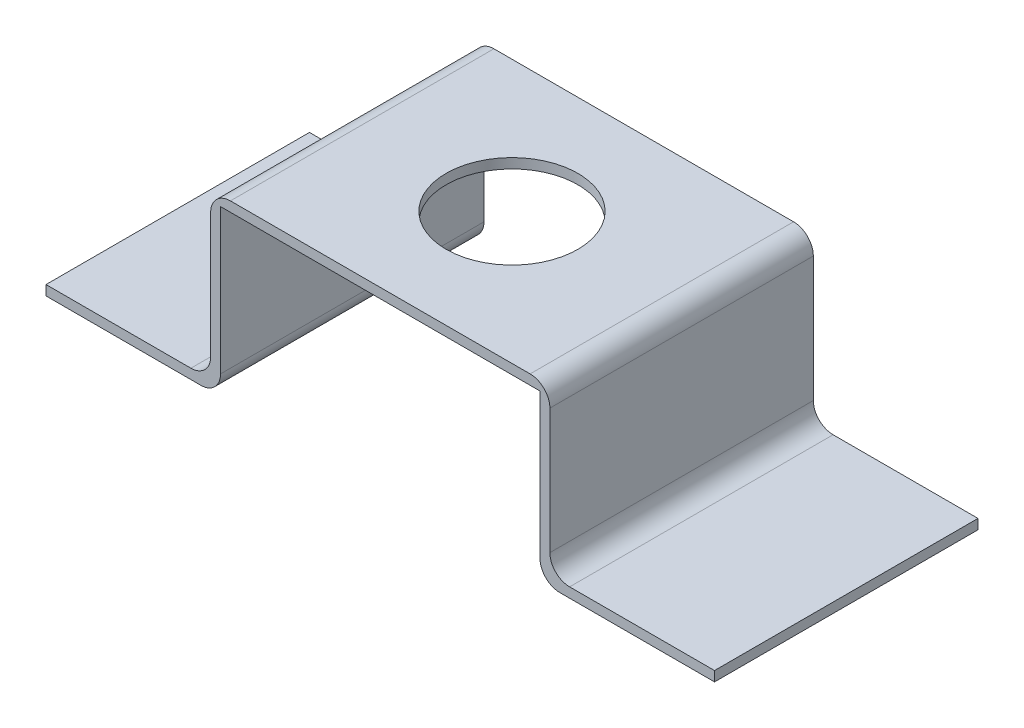
ISO-10303-21;
HEADER;
FILE_DESCRIPTION(('STEP AP214'),'2;1');
FILE_NAME('part.step','',(''),(''),'','','');
FILE_SCHEMA(('AUTOMOTIVE_DESIGN { 1 0 10303 214 1 1 1 1 }'));
ENDSEC;
DATA;
#1=APPLICATION_CONTEXT('core data for automotive mechanical design processes');
#2=APPLICATION_PROTOCOL_DEFINITION('international standard','automotive_design',2000,#1);
#3=PRODUCT_CONTEXT('',#1,'mechanical');
#4=PRODUCT('Part','Part','',(#3));
#5=PRODUCT_RELATED_PRODUCT_CATEGORY('part','',(#4));
#6=PRODUCT_DEFINITION_FORMATION('','',#4);
#7=PRODUCT_DEFINITION_CONTEXT('part definition',#1,'design');
#8=PRODUCT_DEFINITION('design','',#6,#7);
#9=PRODUCT_DEFINITION_SHAPE('','',#8);
#10=(LENGTH_UNIT() NAMED_UNIT(*) SI_UNIT(.MILLI.,.METRE.));
#11=(NAMED_UNIT(*) PLANE_ANGLE_UNIT() SI_UNIT($,.RADIAN.));
#12=(NAMED_UNIT(*) SI_UNIT($,.STERADIAN.) SOLID_ANGLE_UNIT());
#13=UNCERTAINTY_MEASURE_WITH_UNIT(LENGTH_MEASURE(1.E-05),#10,'distance_accuracy_value','');
#14=(GEOMETRIC_REPRESENTATION_CONTEXT(3) GLOBAL_UNCERTAINTY_ASSIGNED_CONTEXT((#13)) GLOBAL_UNIT_ASSIGNED_CONTEXT((#10,
#11,#12)) REPRESENTATION_CONTEXT('',''));
#15=CARTESIAN_POINT('',(0.,0.,0.));
#16=DIRECTION('',(0.,0.,1.));
#17=DIRECTION('',(1.,0.,0.));
#18=AXIS2_PLACEMENT_3D('',#15,#16,#17);
#19=CARTESIAN_POINT('',(-12.5,1.5,-20.));
#20=DIRECTION('',(0.,0.,1.));
#21=DIRECTION('',(1.,0.,0.));
#22=AXIS2_PLACEMENT_3D('',#19,#20,#21);
#23=PLANE('',#22);
#24=DIRECTION('',(-1.,0.,0.));
#25=VECTOR('',#24,1.);
#26=CARTESIAN_POINT('',(12.5,26.5,-20.));
#27=LINE('',#26,#25);
#28=CARTESIAN_POINT('',(61.,26.5,-20.));
#29=VERTEX_POINT('',#28);
#30=CARTESIAN_POINT('',(15.5,26.5,-20.));
#31=VERTEX_POINT('',#30);
#32=EDGE_CURVE('E214',#29,#31,#27,.T.);
#33=ORIENTED_EDGE('',*,*,#32,.F.);
#34=CARTESIAN_POINT('',(61.,23.5,-20.));
#35=DIRECTION('',(0.,0.,1.));
#36=DIRECTION('',(1.,0.,0.));
#37=AXIS2_PLACEMENT_3D('',#34,#35,#36);
#38=CIRCLE('',#37,3.);
#39=CARTESIAN_POINT('',(64.,23.5,-20.));
#40=VERTEX_POINT('',#39);
#41=EDGE_CURVE('E278',#29,#40,#38,.F.);
#42=ORIENTED_EDGE('',*,*,#41,.T.);
#43=DIRECTION('',(0.,1.,0.));
#44=VECTOR('',#43,1.);
#45=CARTESIAN_POINT('',(64.,0.,-20.));
#46=LINE('',#45,#44);
#47=CARTESIAN_POINT('',(64.,4.5,-20.));
#48=VERTEX_POINT('',#47);
#49=EDGE_CURVE('E200',#48,#40,#46,.T.);
#50=ORIENTED_EDGE('',*,*,#49,.F.);
#51=CARTESIAN_POINT('',(67.,4.5,-20.));
#52=DIRECTION('',(0.,0.,1.));
#53=DIRECTION('',(1.,0.,0.));
#54=AXIS2_PLACEMENT_3D('',#51,#52,#53);
#55=CIRCLE('',#54,3.);
#56=CARTESIAN_POINT('',(67.,1.5,-20.));
#57=VERTEX_POINT('',#56);
#58=EDGE_CURVE('E303',#48,#57,#55,.T.);
#59=ORIENTED_EDGE('',*,*,#58,.T.);
#60=DIRECTION('',(-1.,0.,0.));
#61=VECTOR('',#60,1.);
#62=CARTESIAN_POINT('',(64.,1.5,-20.));
#63=LINE('',#62,#61);
#64=CARTESIAN_POINT('',(89.,1.5,-20.));
#65=VERTEX_POINT('',#64);
#66=EDGE_CURVE('E189',#65,#57,#63,.T.);
#67=ORIENTED_EDGE('',*,*,#66,.F.);
#68=DIRECTION('',(0.,-1.,0.));
#69=VECTOR('',#68,1.);
#70=CARTESIAN_POINT('',(89.,1.5,-20.));
#71=LINE('',#70,#69);
#72=CARTESIAN_POINT('',(89.,0.,-20.));
#73=VERTEX_POINT('',#72);
#74=EDGE_CURVE('E184',#65,#73,#71,.T.);
#75=ORIENTED_EDGE('',*,*,#74,.T.);
#76=DIRECTION('',(-1.,0.,0.));
#77=VECTOR('',#76,1.);
#78=CARTESIAN_POINT('',(64.,0.,-20.));
#79=LINE('',#78,#77);
#80=CARTESIAN_POINT('',(65.5,0.,-20.));
#81=VERTEX_POINT('',#80);
#82=EDGE_CURVE('E203',#73,#81,#79,.T.);
#83=ORIENTED_EDGE('',*,*,#82,.T.);
#84=CARTESIAN_POINT('',(65.5,3.,-20.));
#85=DIRECTION('',(0.,0.,1.));
#86=DIRECTION('',(1.,0.,0.));
#87=AXIS2_PLACEMENT_3D('',#84,#85,#86);
#88=CIRCLE('',#87,3.);
#89=CARTESIAN_POINT('',(62.5,3.,-20.));
#90=VERTEX_POINT('',#89);
#91=EDGE_CURVE('E276',#81,#90,#88,.F.);
#92=ORIENTED_EDGE('',*,*,#91,.T.);
#93=DIRECTION('',(0.,1.,0.));
#94=VECTOR('',#93,1.);
#95=CARTESIAN_POINT('',(62.5,0.,-20.));
#96=LINE('',#95,#94);
#97=CARTESIAN_POINT('',(62.5,25.,-20.));
#98=VERTEX_POINT('',#97);
#99=EDGE_CURVE('E201',#90,#98,#96,.T.);
#100=ORIENTED_EDGE('',*,*,#99,.T.);
#101=DIRECTION('',(-1.,0.,0.));
#102=VECTOR('',#101,1.);
#103=CARTESIAN_POINT('',(12.5,25.,-20.));
#104=LINE('',#103,#102);
#105=CARTESIAN_POINT('',(14.,25.,-20.));
#106=VERTEX_POINT('',#105);
#107=EDGE_CURVE('E215',#98,#106,#104,.T.);
#108=ORIENTED_EDGE('',*,*,#107,.T.);
#109=DIRECTION('',(0.,1.,0.));
#110=VECTOR('',#109,1.);
#111=CARTESIAN_POINT('',(14.,25.,-20.));
#112=LINE('',#111,#110);
#113=CARTESIAN_POINT('',(14.,3.,-20.));
#114=VERTEX_POINT('',#113);
#115=EDGE_CURVE('E225',#114,#106,#112,.T.);
#116=ORIENTED_EDGE('',*,*,#115,.F.);
#117=CARTESIAN_POINT('',(11.,3.,-20.));
#118=DIRECTION('',(0.,0.,1.));
#119=DIRECTION('',(1.,0.,0.));
#120=AXIS2_PLACEMENT_3D('',#117,#118,#119);
#121=CIRCLE('',#120,3.);
#122=CARTESIAN_POINT('',(11.,0.,-20.));
#123=VERTEX_POINT('',#122);
#124=EDGE_CURVE('E274',#114,#123,#121,.F.);
#125=ORIENTED_EDGE('',*,*,#124,.T.);
#126=DIRECTION('',(-1.,0.,0.));
#127=VECTOR('',#126,1.);
#128=CARTESIAN_POINT('',(-12.5,0.,-20.));
#129=LINE('',#128,#127);
#130=CARTESIAN_POINT('',(-12.5,0.,-20.));
#131=VERTEX_POINT('',#130);
#132=EDGE_CURVE('E234',#123,#131,#129,.T.);
#133=ORIENTED_EDGE('',*,*,#132,.T.);
#134=DIRECTION('',(0.,-1.,0.));
#135=VECTOR('',#134,1.);
#136=CARTESIAN_POINT('',(-12.5,1.5,-20.));
#137=LINE('',#136,#135);
#138=CARTESIAN_POINT('',(-12.5,1.5,-20.));
#139=VERTEX_POINT('',#138);
#140=EDGE_CURVE('E253',#139,#131,#137,.T.);
#141=ORIENTED_EDGE('',*,*,#140,.F.);
#142=DIRECTION('',(-1.,0.,0.));
#143=VECTOR('',#142,1.);
#144=CARTESIAN_POINT('',(-12.5,1.5,-20.));
#145=LINE('',#144,#143);
#146=CARTESIAN_POINT('',(9.5,1.5,-20.));
#147=VERTEX_POINT('',#146);
#148=EDGE_CURVE('E237',#147,#139,#145,.T.);
#149=ORIENTED_EDGE('',*,*,#148,.F.);
#150=CARTESIAN_POINT('',(9.5,4.5,-20.));
#151=DIRECTION('',(0.,0.,1.));
#152=DIRECTION('',(1.,0.,0.));
#153=AXIS2_PLACEMENT_3D('',#150,#151,#152);
#154=CIRCLE('',#153,3.);
#155=CARTESIAN_POINT('',(12.5,4.5,-20.));
#156=VERTEX_POINT('',#155);
#157=EDGE_CURVE('E46',#147,#156,#154,.T.);
#158=ORIENTED_EDGE('',*,*,#157,.T.);
#159=DIRECTION('',(0.,1.,0.));
#160=VECTOR('',#159,1.);
#161=CARTESIAN_POINT('',(12.5,25.,-20.));
#162=LINE('',#161,#160);
#163=CARTESIAN_POINT('',(12.5,23.5,-20.));
#164=VERTEX_POINT('',#163);
#165=EDGE_CURVE('E218',#156,#164,#162,.T.);
#166=ORIENTED_EDGE('',*,*,#165,.T.);
#167=CARTESIAN_POINT('',(15.5,23.5,-20.));
#168=DIRECTION('',(0.,0.,1.));
#169=DIRECTION('',(1.,0.,0.));
#170=AXIS2_PLACEMENT_3D('',#167,#168,#169);
#171=CIRCLE('',#170,3.);
#172=EDGE_CURVE('E272',#164,#31,#171,.F.);
#173=ORIENTED_EDGE('',*,*,#172,.T.);
#174=EDGE_LOOP('',(#33,#42,#50,#59,#67,#75,#83,#92,#100,#108,#116,#125,#133,#141,#149,#158,#166,#173));
#175=FACE_BOUND('',#174,.T.);
#176=ADVANCED_FACE('F38',(#175),#23,.F.);
#177=CARTESIAN_POINT('',(-12.5,1.5,20.));
#178=DIRECTION('',(1.,0.,0.));
#179=DIRECTION('',(0.,0.,-1.));
#180=AXIS2_PLACEMENT_3D('',#177,#178,#179);
#181=PLANE('',#180);
#182=DIRECTION('',(0.,0.,1.));
#183=VECTOR('',#182,1.);
#184=CARTESIAN_POINT('',(-12.5,0.,20.));
#185=LINE('',#184,#183);
#186=CARTESIAN_POINT('',(-12.5,0.,20.));
#187=VERTEX_POINT('',#186);
#188=EDGE_CURVE('E247',#131,#187,#185,.T.);
#189=ORIENTED_EDGE('',*,*,#188,.T.);
#190=DIRECTION('',(0.,-1.,0.));
#191=VECTOR('',#190,1.);
#192=CARTESIAN_POINT('',(-12.5,1.5,20.));
#193=LINE('',#192,#191);
#194=CARTESIAN_POINT('',(-12.5,1.5,20.));
#195=VERTEX_POINT('',#194);
#196=EDGE_CURVE('E245',#195,#187,#193,.T.);
#197=ORIENTED_EDGE('',*,*,#196,.F.);
#198=DIRECTION('',(0.,0.,1.));
#199=VECTOR('',#198,1.);
#200=CARTESIAN_POINT('',(-12.5,1.5,20.));
#201=LINE('',#200,#199);
#202=EDGE_CURVE('E239',#139,#195,#201,.T.);
#203=ORIENTED_EDGE('',*,*,#202,.F.);
#204=ORIENTED_EDGE('',*,*,#140,.T.);
#205=EDGE_LOOP('',(#189,#197,#203,#204));
#206=FACE_BOUND('',#205,.T.);
#207=ADVANCED_FACE('F336',(#206),#181,.F.);
#208=CARTESIAN_POINT('',(-12.5,1.5,20.));
#209=DIRECTION('',(0.,0.,-1.));
#210=DIRECTION('',(-1.,0.,0.));
#211=AXIS2_PLACEMENT_3D('',#208,#209,#210);
#212=PLANE('',#211);
#213=DIRECTION('',(0.,-1.,0.));
#214=VECTOR('',#213,1.);
#215=CARTESIAN_POINT('',(64.,26.5,20.));
#216=LINE('',#215,#214);
#217=CARTESIAN_POINT('',(64.,23.5,20.));
#218=VERTEX_POINT('',#217);
#219=CARTESIAN_POINT('',(64.,4.5,20.));
#220=VERTEX_POINT('',#219);
#221=EDGE_CURVE('E197',#218,#220,#216,.T.);
#222=ORIENTED_EDGE('',*,*,#221,.F.);
#223=CARTESIAN_POINT('',(61.,23.5,20.));
#224=DIRECTION('',(0.,0.,-1.));
#225=DIRECTION('',(-1.,0.,0.));
#226=AXIS2_PLACEMENT_3D('',#223,#224,#225);
#227=CIRCLE('',#226,3.);
#228=CARTESIAN_POINT('',(61.,26.5,20.));
#229=VERTEX_POINT('',#228);
#230=EDGE_CURVE('E265',#218,#229,#227,.F.);
#231=ORIENTED_EDGE('',*,*,#230,.T.);
#232=DIRECTION('',(1.,0.,0.));
#233=VECTOR('',#232,1.);
#234=CARTESIAN_POINT('',(62.5,26.5,20.));
#235=LINE('',#234,#233);
#236=CARTESIAN_POINT('',(15.5,26.5,20.));
#237=VERTEX_POINT('',#236);
#238=EDGE_CURVE('E211',#237,#229,#235,.T.);
#239=ORIENTED_EDGE('',*,*,#238,.F.);
#240=CARTESIAN_POINT('',(15.5,23.5,20.));
#241=DIRECTION('',(0.,0.,-1.));
#242=DIRECTION('',(-1.,0.,0.));
#243=AXIS2_PLACEMENT_3D('',#240,#241,#242);
#244=CIRCLE('',#243,3.);
#245=CARTESIAN_POINT('',(12.5,23.5,20.));
#246=VERTEX_POINT('',#245);
#247=EDGE_CURVE('E259',#237,#246,#244,.F.);
#248=ORIENTED_EDGE('',*,*,#247,.T.);
#249=DIRECTION('',(0.,-1.,0.));
#250=VECTOR('',#249,1.);
#251=CARTESIAN_POINT('',(12.5,0.,20.));
#252=LINE('',#251,#250);
#253=CARTESIAN_POINT('',(12.5,4.5,20.));
#254=VERTEX_POINT('',#253);
#255=EDGE_CURVE('E228',#246,#254,#252,.T.);
#256=ORIENTED_EDGE('',*,*,#255,.T.);
#257=CARTESIAN_POINT('',(9.5,4.5,20.));
#258=DIRECTION('',(0.,0.,-1.));
#259=DIRECTION('',(-1.,0.,0.));
#260=AXIS2_PLACEMENT_3D('',#257,#258,#259);
#261=CIRCLE('',#260,3.);
#262=CARTESIAN_POINT('',(9.5,1.5,20.));
#263=VERTEX_POINT('',#262);
#264=EDGE_CURVE('E11',#254,#263,#261,.T.);
#265=ORIENTED_EDGE('',*,*,#264,.T.);
#266=DIRECTION('',(1.,0.,0.));
#267=VECTOR('',#266,1.);
#268=CARTESIAN_POINT('',(-12.5,1.5,20.));
#269=LINE('',#268,#267);
#270=EDGE_CURVE('E242',#195,#263,#269,.T.);
#271=ORIENTED_EDGE('',*,*,#270,.F.);
#272=ORIENTED_EDGE('',*,*,#196,.T.);
#273=DIRECTION('',(1.,0.,0.));
#274=VECTOR('',#273,1.);
#275=CARTESIAN_POINT('',(-12.5,0.,20.));
#276=LINE('',#275,#274);
#277=CARTESIAN_POINT('',(11.,0.,20.));
#278=VERTEX_POINT('',#277);
#279=EDGE_CURVE('E240',#187,#278,#276,.T.);
#280=ORIENTED_EDGE('',*,*,#279,.T.);
#281=CARTESIAN_POINT('',(11.,3.,20.));
#282=DIRECTION('',(0.,0.,-1.));
#283=DIRECTION('',(-1.,0.,0.));
#284=AXIS2_PLACEMENT_3D('',#281,#282,#283);
#285=CIRCLE('',#284,3.);
#286=CARTESIAN_POINT('',(14.,3.,20.));
#287=VERTEX_POINT('',#286);
#288=EDGE_CURVE('E261',#278,#287,#285,.F.);
#289=ORIENTED_EDGE('',*,*,#288,.T.);
#290=DIRECTION('',(0.,-1.,0.));
#291=VECTOR('',#290,1.);
#292=CARTESIAN_POINT('',(14.,0.,20.));
#293=LINE('',#292,#291);
#294=CARTESIAN_POINT('',(14.,25.,20.));
#295=VERTEX_POINT('',#294);
#296=EDGE_CURVE('E231',#295,#287,#293,.T.);
#297=ORIENTED_EDGE('',*,*,#296,.F.);
#298=DIRECTION('',(1.,0.,0.));
#299=VECTOR('',#298,1.);
#300=CARTESIAN_POINT('',(62.5,25.,20.));
#301=LINE('',#300,#299);
#302=CARTESIAN_POINT('',(62.5,25.,20.));
#303=VERTEX_POINT('',#302);
#304=EDGE_CURVE('E210',#295,#303,#301,.T.);
#305=ORIENTED_EDGE('',*,*,#304,.T.);
#306=DIRECTION('',(0.,-1.,0.));
#307=VECTOR('',#306,1.);
#308=CARTESIAN_POINT('',(62.5,26.5,20.));
#309=LINE('',#308,#307);
#310=CARTESIAN_POINT('',(62.5,3.,20.));
#311=VERTEX_POINT('',#310);
#312=EDGE_CURVE('E183',#303,#311,#309,.T.);
#313=ORIENTED_EDGE('',*,*,#312,.T.);
#314=CARTESIAN_POINT('',(65.5,3.,20.));
#315=DIRECTION('',(0.,0.,-1.));
#316=DIRECTION('',(-1.,0.,0.));
#317=AXIS2_PLACEMENT_3D('',#314,#315,#316);
#318=CIRCLE('',#317,3.);
#319=CARTESIAN_POINT('',(65.5,0.,20.));
#320=VERTEX_POINT('',#319);
#321=EDGE_CURVE('E263',#311,#320,#318,.F.);
#322=ORIENTED_EDGE('',*,*,#321,.T.);
#323=DIRECTION('',(-1.,0.,0.));
#324=VECTOR('',#323,1.);
#325=CARTESIAN_POINT('',(64.,0.,20.));
#326=LINE('',#325,#324);
#327=CARTESIAN_POINT('',(89.,0.,20.));
#328=VERTEX_POINT('',#327);
#329=EDGE_CURVE('E179',#328,#320,#326,.T.);
#330=ORIENTED_EDGE('',*,*,#329,.F.);
#331=DIRECTION('',(0.,-1.,0.));
#332=VECTOR('',#331,1.);
#333=CARTESIAN_POINT('',(89.,1.5,20.));
#334=LINE('',#333,#332);
#335=CARTESIAN_POINT('',(89.,1.5,20.));
#336=VERTEX_POINT('',#335);
#337=EDGE_CURVE('E175',#336,#328,#334,.T.);
#338=ORIENTED_EDGE('',*,*,#337,.F.);
#339=DIRECTION('',(1.,0.,0.));
#340=VECTOR('',#339,1.);
#341=CARTESIAN_POINT('',(89.,1.5,20.));
#342=LINE('',#341,#340);
#343=CARTESIAN_POINT('',(67.,1.5,20.));
#344=VERTEX_POINT('',#343);
#345=EDGE_CURVE('E162',#344,#336,#342,.T.);
#346=ORIENTED_EDGE('',*,*,#345,.F.);
#347=CARTESIAN_POINT('',(67.,4.5,20.));
#348=DIRECTION('',(0.,0.,-1.));
#349=DIRECTION('',(-1.,0.,0.));
#350=AXIS2_PLACEMENT_3D('',#347,#348,#349);
#351=CIRCLE('',#350,3.);
#352=EDGE_CURVE('E301',#344,#220,#351,.T.);
#353=ORIENTED_EDGE('',*,*,#352,.T.);
#354=EDGE_LOOP('',(#222,#231,#239,#248,#256,#265,#271,#272,#280,#289,#297,#305,#313,#322,#330,
#338,#346,#353));
#355=FACE_BOUND('',#354,.T.);
#356=ADVANCED_FACE('F177',(#355),#212,.F.);
#357=CARTESIAN_POINT('',(0.,1.5,0.));
#358=DIRECTION('',(0.,1.,0.));
#359=DIRECTION('',(0.,0.,1.));
#360=AXIS2_PLACEMENT_3D('',#357,#358,#359);
#361=PLANE('',#360);
#362=ORIENTED_EDGE('',*,*,#270,.T.);
#363=DIRECTION('',(0.,0.,-1.));
#364=VECTOR('',#363,1.);
#365=CARTESIAN_POINT('',(9.5,1.5,-20.));
#366=LINE('',#365,#364);
#367=EDGE_CURVE('E297',#263,#147,#366,.T.);
#368=ORIENTED_EDGE('',*,*,#367,.T.);
#369=ORIENTED_EDGE('',*,*,#148,.T.);
#370=ORIENTED_EDGE('',*,*,#202,.T.);
#371=EDGE_LOOP('',(#362,#368,#369,#370));
#372=FACE_BOUND('',#371,.T.);
#373=ADVANCED_FACE('F331',(#372),#361,.T.);
#374=CARTESIAN_POINT('',(0.,0.,0.));
#375=DIRECTION('',(0.,1.,0.));
#376=DIRECTION('',(0.,0.,1.));
#377=AXIS2_PLACEMENT_3D('',#374,#375,#376);
#378=PLANE('',#377);
#379=ORIENTED_EDGE('',*,*,#132,.F.);
#380=DIRECTION('',(0.,0.,-1.));
#381=VECTOR('',#380,1.);
#382=CARTESIAN_POINT('',(11.,0.,0.));
#383=LINE('',#382,#381);
#384=EDGE_CURVE('E289',#123,#278,#383,.F.);
#385=ORIENTED_EDGE('',*,*,#384,.T.);
#386=ORIENTED_EDGE('',*,*,#279,.F.);
#387=ORIENTED_EDGE('',*,*,#188,.F.);
#388=EDGE_LOOP('',(#379,#385,#386,#387));
#389=FACE_BOUND('',#388,.T.);
#390=ADVANCED_FACE('F342',(#389),#378,.F.);
#391=CARTESIAN_POINT('',(12.5,0.,0.));
#392=DIRECTION('',(-1.,0.,0.));
#393=DIRECTION('',(0.,0.,1.));
#394=AXIS2_PLACEMENT_3D('',#391,#392,#393);
#395=PLANE('',#394);
#396=ORIENTED_EDGE('',*,*,#165,.F.);
#397=DIRECTION('',(0.,0.,-1.));
#398=VECTOR('',#397,1.);
#399=CARTESIAN_POINT('',(12.5,4.5,20.));
#400=LINE('',#399,#398);
#401=EDGE_CURVE('E59',#156,#254,#400,.F.);
#402=ORIENTED_EDGE('',*,*,#401,.T.);
#403=ORIENTED_EDGE('',*,*,#255,.F.);
#404=DIRECTION('',(0.,0.,1.));
#405=VECTOR('',#404,1.);
#406=CARTESIAN_POINT('',(12.5,23.5,-20.));
#407=LINE('',#406,#405);
#408=EDGE_CURVE('E291',#246,#164,#407,.F.);
#409=ORIENTED_EDGE('',*,*,#408,.T.);
#410=EDGE_LOOP('',(#396,#402,#403,#409));
#411=FACE_BOUND('',#410,.T.);
#412=ADVANCED_FACE('F326',(#411),#395,.T.);
#413=CARTESIAN_POINT('',(14.,0.,0.));
#414=DIRECTION('',(-1.,0.,0.));
#415=DIRECTION('',(0.,0.,1.));
#416=AXIS2_PLACEMENT_3D('',#413,#414,#415);
#417=PLANE('',#416);
#418=ORIENTED_EDGE('',*,*,#296,.T.);
#419=DIRECTION('',(0.,0.,-1.));
#420=VECTOR('',#419,1.);
#421=CARTESIAN_POINT('',(14.,3.,0.));
#422=LINE('',#421,#420);
#423=EDGE_CURVE('E286',#287,#114,#422,.T.);
#424=ORIENTED_EDGE('',*,*,#423,.T.);
#425=ORIENTED_EDGE('',*,*,#115,.T.);
#426=DIRECTION('',(0.,0.,1.));
#427=VECTOR('',#426,1.);
#428=CARTESIAN_POINT('',(14.,25.,20.));
#429=LINE('',#428,#427);
#430=EDGE_CURVE('E227',#106,#295,#429,.T.);
#431=ORIENTED_EDGE('',*,*,#430,.T.);
#432=EDGE_LOOP('',(#418,#424,#425,#431));
#433=FACE_BOUND('',#432,.T.);
#434=ADVANCED_FACE('F349',(#433),#417,.F.);
#435=CARTESIAN_POINT('',(0.,25.,0.));
#436=DIRECTION('',(0.,-1.,0.));
#437=DIRECTION('',(0.,0.,-1.));
#438=AXIS2_PLACEMENT_3D('',#435,#436,#437);
#439=PLANE('',#438);
#440=CARTESIAN_POINT('',(38.25,25.,0.));
#441=DIRECTION('',(0.,1.,0.));
#442=DIRECTION('',(0.,0.,1.));
#443=AXIS2_PLACEMENT_3D('',#440,#441,#442);
#444=CIRCLE('',#443,10.);
#445=CARTESIAN_POINT('',(38.25,25.,10.));
#446=VERTEX_POINT('',#445);
#447=EDGE_CURVE('E195',#446,#446,#444,.T.);
#448=ORIENTED_EDGE('',*,*,#447,.T.);
#449=EDGE_LOOP('',(#448));
#450=FACE_BOUND('',#449,.T.);
#451=ORIENTED_EDGE('',*,*,#430,.F.);
#452=ORIENTED_EDGE('',*,*,#107,.F.);
#453=DIRECTION('',(0.,0.,-1.));
#454=VECTOR('',#453,1.);
#455=CARTESIAN_POINT('',(62.5,25.,-20.));
#456=LINE('',#455,#454);
#457=EDGE_CURVE('E220',#303,#98,#456,.T.);
#458=ORIENTED_EDGE('',*,*,#457,.F.);
#459=ORIENTED_EDGE('',*,*,#304,.F.);
#460=EDGE_LOOP('',(#451,#452,#458,#459));
#461=FACE_BOUND('',#460,.T.);
#462=ADVANCED_FACE('F354',(#450,#461),#439,.T.);
#463=CARTESIAN_POINT('',(0.,26.5,0.));
#464=DIRECTION('',(0.,-1.,0.));
#465=DIRECTION('',(0.,0.,-1.));
#466=AXIS2_PLACEMENT_3D('',#463,#464,#465);
#467=PLANE('',#466);
#468=CARTESIAN_POINT('',(38.25,26.5,0.));
#469=DIRECTION('',(0.,1.,0.));
#470=DIRECTION('',(0.,0.,1.));
#471=AXIS2_PLACEMENT_3D('',#468,#469,#470);
#472=CIRCLE('',#471,10.);
#473=CARTESIAN_POINT('',(38.25,26.5,10.));
#474=VERTEX_POINT('',#473);
#475=EDGE_CURVE('E577',#474,#474,#472,.T.);
#476=ORIENTED_EDGE('',*,*,#475,.F.);
#477=EDGE_LOOP('',(#476));
#478=FACE_BOUND('',#477,.T.);
#479=ORIENTED_EDGE('',*,*,#238,.T.);
#480=DIRECTION('',(0.,0.,1.));
#481=VECTOR('',#480,1.);
#482=CARTESIAN_POINT('',(61.,26.5,-20.));
#483=LINE('',#482,#481);
#484=EDGE_CURVE('E270',#229,#29,#483,.F.);
#485=ORIENTED_EDGE('',*,*,#484,.T.);
#486=ORIENTED_EDGE('',*,*,#32,.T.);
#487=DIRECTION('',(0.,0.,1.));
#488=VECTOR('',#487,1.);
#489=CARTESIAN_POINT('',(15.5,26.5,20.));
#490=LINE('',#489,#488);
#491=EDGE_CURVE('E267',#31,#237,#490,.T.);
#492=ORIENTED_EDGE('',*,*,#491,.T.);
#493=EDGE_LOOP('',(#479,#485,#486,#492));
#494=FACE_BOUND('',#493,.T.);
#495=ADVANCED_FACE('F319',(#478,#494),#467,.F.);
#496=CARTESIAN_POINT('',(62.5,0.,0.));
#497=DIRECTION('',(1.,0.,0.));
#498=DIRECTION('',(0.,0.,-1.));
#499=AXIS2_PLACEMENT_3D('',#496,#497,#498);
#500=PLANE('',#499);
#501=ORIENTED_EDGE('',*,*,#99,.F.);
#502=DIRECTION('',(0.,0.,-1.));
#503=VECTOR('',#502,1.);
#504=CARTESIAN_POINT('',(62.5,3.,0.));
#505=LINE('',#504,#503);
#506=EDGE_CURVE('E284',#90,#311,#505,.F.);
#507=ORIENTED_EDGE('',*,*,#506,.T.);
#508=ORIENTED_EDGE('',*,*,#312,.F.);
#509=ORIENTED_EDGE('',*,*,#457,.T.);
#510=EDGE_LOOP('',(#501,#507,#508,#509));
#511=FACE_BOUND('',#510,.T.);
#512=ADVANCED_FACE('F359',(#511),#500,.F.);
#513=CARTESIAN_POINT('',(64.,0.,20.));
#514=DIRECTION('',(0.,1.,0.));
#515=DIRECTION('',(0.,0.,1.));
#516=AXIS2_PLACEMENT_3D('',#513,#514,#515);
#517=PLANE('',#516);
#518=ORIENTED_EDGE('',*,*,#329,.T.);
#519=DIRECTION('',(0.,0.,-1.));
#520=VECTOR('',#519,1.);
#521=CARTESIAN_POINT('',(65.5,0.,20.));
#522=LINE('',#521,#520);
#523=EDGE_CURVE('E281',#320,#81,#522,.T.);
#524=ORIENTED_EDGE('',*,*,#523,.T.);
#525=ORIENTED_EDGE('',*,*,#82,.F.);
#526=DIRECTION('',(0.,0.,-1.));
#527=VECTOR('',#526,1.);
#528=CARTESIAN_POINT('',(89.,0.,-20.));
#529=LINE('',#528,#527);
#530=EDGE_CURVE('E172',#328,#73,#529,.T.);
#531=ORIENTED_EDGE('',*,*,#530,.F.);
#532=EDGE_LOOP('',(#518,#524,#525,#531));
#533=FACE_BOUND('',#532,.T.);
#534=ADVANCED_FACE('F366',(#533),#517,.F.);
#535=CARTESIAN_POINT('',(64.,0.,0.));
#536=DIRECTION('',(1.,0.,0.));
#537=DIRECTION('',(0.,0.,-1.));
#538=AXIS2_PLACEMENT_3D('',#535,#536,#537);
#539=PLANE('',#538);
#540=ORIENTED_EDGE('',*,*,#221,.T.);
#541=DIRECTION('',(0.,0.,1.));
#542=VECTOR('',#541,1.);
#543=CARTESIAN_POINT('',(64.,4.5,0.));
#544=LINE('',#543,#542);
#545=EDGE_CURVE('E295',#220,#48,#544,.F.);
#546=ORIENTED_EDGE('',*,*,#545,.T.);
#547=ORIENTED_EDGE('',*,*,#49,.T.);
#548=DIRECTION('',(0.,0.,1.));
#549=VECTOR('',#548,1.);
#550=CARTESIAN_POINT('',(64.,23.5,20.));
#551=LINE('',#550,#549);
#552=EDGE_CURVE('E256',#40,#218,#551,.T.);
#553=ORIENTED_EDGE('',*,*,#552,.T.);
#554=EDGE_LOOP('',(#540,#546,#547,#553));
#555=FACE_BOUND('',#554,.T.);
#556=ADVANCED_FACE('F311',(#555),#539,.T.);
#557=CARTESIAN_POINT('',(89.,1.5,-20.));
#558=DIRECTION('',(-1.,0.,0.));
#559=DIRECTION('',(0.,0.,1.));
#560=AXIS2_PLACEMENT_3D('',#557,#558,#559);
#561=PLANE('',#560);
#562=ORIENTED_EDGE('',*,*,#530,.T.);
#563=ORIENTED_EDGE('',*,*,#74,.F.);
#564=DIRECTION('',(0.,0.,-1.));
#565=VECTOR('',#564,1.);
#566=CARTESIAN_POINT('',(89.,1.5,-20.));
#567=LINE('',#566,#565);
#568=EDGE_CURVE('E167',#336,#65,#567,.T.);
#569=ORIENTED_EDGE('',*,*,#568,.F.);
#570=ORIENTED_EDGE('',*,*,#337,.T.);
#571=EDGE_LOOP('',(#562,#563,#569,#570));
#572=FACE_BOUND('',#571,.T.);
#573=ADVANCED_FACE('F186',(#572),#561,.F.);
#574=CARTESIAN_POINT('',(0.,1.5,0.));
#575=DIRECTION('',(0.,-1.,0.));
#576=DIRECTION('',(0.,0.,-1.));
#577=AXIS2_PLACEMENT_3D('',#574,#575,#576);
#578=PLANE('',#577);
#579=ORIENTED_EDGE('',*,*,#66,.T.);
#580=DIRECTION('',(0.,0.,1.));
#581=VECTOR('',#580,1.);
#582=CARTESIAN_POINT('',(67.,1.5,0.));
#583=LINE('',#582,#581);
#584=EDGE_CURVE('E170',#57,#344,#583,.T.);
#585=ORIENTED_EDGE('',*,*,#584,.T.);
#586=ORIENTED_EDGE('',*,*,#345,.T.);
#587=ORIENTED_EDGE('',*,*,#568,.T.);
#588=EDGE_LOOP('',(#579,#585,#586,#587));
#589=FACE_BOUND('',#588,.T.);
#590=ADVANCED_FACE('F165',(#589),#578,.F.);
#591=CARTESIAN_POINT('',(61.,23.5,0.));
#592=DIRECTION('',(0.,0.,-1.));
#593=DIRECTION('',(-1.,0.,0.));
#594=AXIS2_PLACEMENT_3D('',#591,#592,#593);
#595=CYLINDRICAL_SURFACE('',#594,3.);
#596=ORIENTED_EDGE('',*,*,#41,.F.);
#597=ORIENTED_EDGE('',*,*,#484,.F.);
#598=ORIENTED_EDGE('',*,*,#230,.F.);
#599=ORIENTED_EDGE('',*,*,#552,.F.);
#600=EDGE_LOOP('',(#596,#597,#598,#599));
#601=FACE_BOUND('',#600,.T.);
#602=ADVANCED_FACE('F315',(#601),#595,.T.);
#603=CARTESIAN_POINT('',(65.5,3.,20.));
#604=DIRECTION('',(0.,0.,-1.));
#605=DIRECTION('',(-1.,0.,0.));
#606=AXIS2_PLACEMENT_3D('',#603,#604,#605);
#607=CYLINDRICAL_SURFACE('',#606,3.);
#608=ORIENTED_EDGE('',*,*,#321,.F.);
#609=ORIENTED_EDGE('',*,*,#506,.F.);
#610=ORIENTED_EDGE('',*,*,#91,.F.);
#611=ORIENTED_EDGE('',*,*,#523,.F.);
#612=EDGE_LOOP('',(#608,#609,#610,#611));
#613=FACE_BOUND('',#612,.T.);
#614=ADVANCED_FACE('F363',(#613),#607,.T.);
#615=CARTESIAN_POINT('',(11.,3.,0.));
#616=DIRECTION('',(0.,0.,-1.));
#617=DIRECTION('',(-1.,0.,0.));
#618=AXIS2_PLACEMENT_3D('',#615,#616,#617);
#619=CYLINDRICAL_SURFACE('',#618,3.);
#620=ORIENTED_EDGE('',*,*,#288,.F.);
#621=ORIENTED_EDGE('',*,*,#384,.F.);
#622=ORIENTED_EDGE('',*,*,#124,.F.);
#623=ORIENTED_EDGE('',*,*,#423,.F.);
#624=EDGE_LOOP('',(#620,#621,#622,#623));
#625=FACE_BOUND('',#624,.T.);
#626=ADVANCED_FACE('F345',(#625),#619,.T.);
#627=CARTESIAN_POINT('',(15.5,23.5,0.));
#628=DIRECTION('',(0.,0.,-1.));
#629=DIRECTION('',(-1.,0.,0.));
#630=AXIS2_PLACEMENT_3D('',#627,#628,#629);
#631=CYLINDRICAL_SURFACE('',#630,3.);
#632=ORIENTED_EDGE('',*,*,#172,.F.);
#633=ORIENTED_EDGE('',*,*,#408,.F.);
#634=ORIENTED_EDGE('',*,*,#247,.F.);
#635=ORIENTED_EDGE('',*,*,#491,.F.);
#636=EDGE_LOOP('',(#632,#633,#634,#635));
#637=FACE_BOUND('',#636,.T.);
#638=ADVANCED_FACE('F323',(#637),#631,.T.);
#639=CARTESIAN_POINT('',(38.25,25.,0.));
#640=DIRECTION('',(0.,1.,0.));
#641=DIRECTION('',(0.,0.,1.));
#642=AXIS2_PLACEMENT_3D('',#639,#640,#641);
#643=CYLINDRICAL_SURFACE('',#642,10.);
#644=ORIENTED_EDGE('',*,*,#447,.F.);
#645=EDGE_LOOP('',(#644));
#646=FACE_BOUND('',#645,.T.);
#647=ORIENTED_EDGE('',*,*,#475,.T.);
#648=EDGE_LOOP('',(#647));
#649=FACE_BOUND('',#648,.T.);
#650=ADVANCED_FACE('F391',(#646,#649),#643,.F.);
#651=CARTESIAN_POINT('',(67.,4.5,0.));
#652=DIRECTION('',(0.,0.,1.));
#653=DIRECTION('',(1.,0.,0.));
#654=AXIS2_PLACEMENT_3D('',#651,#652,#653);
#655=CYLINDRICAL_SURFACE('',#654,3.);
#656=ORIENTED_EDGE('',*,*,#58,.F.);
#657=ORIENTED_EDGE('',*,*,#545,.F.);
#658=ORIENTED_EDGE('',*,*,#352,.F.);
#659=ORIENTED_EDGE('',*,*,#584,.F.);
#660=EDGE_LOOP('',(#656,#657,#658,#659));
#661=FACE_BOUND('',#660,.T.);
#662=ADVANCED_FACE('F309',(#661),#655,.F.);
#663=CARTESIAN_POINT('',(9.5,4.5,0.));
#664=DIRECTION('',(0.,0.,1.));
#665=DIRECTION('',(1.,0.,0.));
#666=AXIS2_PLACEMENT_3D('',#663,#664,#665);
#667=CYLINDRICAL_SURFACE('',#666,3.);
#668=ORIENTED_EDGE('',*,*,#264,.F.);
#669=ORIENTED_EDGE('',*,*,#401,.F.);
#670=ORIENTED_EDGE('',*,*,#157,.F.);
#671=ORIENTED_EDGE('',*,*,#367,.F.);
#672=EDGE_LOOP('',(#668,#669,#670,#671));
#673=FACE_BOUND('',#672,.T.);
#674=ADVANCED_FACE('F40',(#673),#667,.F.);
#675=CLOSED_SHELL('',(#176,#207,#356,#373,#390,#412,#434,#462,#495,#512,#534,#556,#573,#590,
#602,#614,#626,#638,#650,#662,#674));
#676=MANIFOLD_SOLID_BREP('B2',#675);
#677=ADVANCED_BREP_SHAPE_REPRESENTATION('',(#18,#676),#14);
#678=SHAPE_DEFINITION_REPRESENTATION(#9,#677);
ENDSEC;
END-ISO-10303-21;
